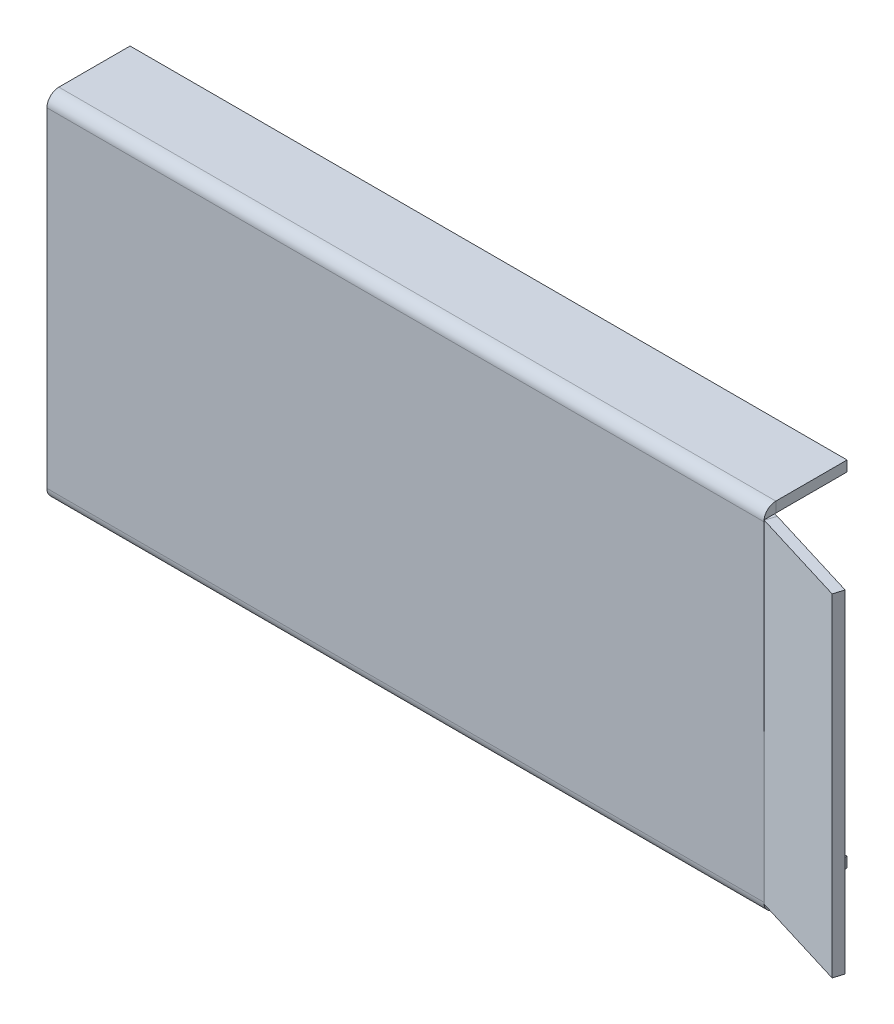
ISO-10303-21;
HEADER;
FILE_DESCRIPTION(('STEP AP214'),'2;1');
FILE_NAME('part.step','',(''),(''),'','','');
FILE_SCHEMA(('AUTOMOTIVE_DESIGN { 1 0 10303 214 1 1 1 1 }'));
ENDSEC;
DATA;
#1=APPLICATION_CONTEXT('core data for automotive mechanical design processes');
#2=APPLICATION_PROTOCOL_DEFINITION('international standard','automotive_design',2000,#1);
#3=PRODUCT_CONTEXT('',#1,'mechanical');
#4=PRODUCT('Part','Part','',(#3));
#5=PRODUCT_RELATED_PRODUCT_CATEGORY('part','',(#4));
#6=PRODUCT_DEFINITION_FORMATION('','',#4);
#7=PRODUCT_DEFINITION_CONTEXT('part definition',#1,'design');
#8=PRODUCT_DEFINITION('design','',#6,#7);
#9=PRODUCT_DEFINITION_SHAPE('','',#8);
#10=(LENGTH_UNIT() NAMED_UNIT(*) SI_UNIT(.MILLI.,.METRE.));
#11=(NAMED_UNIT(*) PLANE_ANGLE_UNIT() SI_UNIT($,.RADIAN.));
#12=(NAMED_UNIT(*) SI_UNIT($,.STERADIAN.) SOLID_ANGLE_UNIT());
#13=UNCERTAINTY_MEASURE_WITH_UNIT(LENGTH_MEASURE(1.E-05),#10,'distance_accuracy_value','');
#14=(GEOMETRIC_REPRESENTATION_CONTEXT(3) GLOBAL_UNCERTAINTY_ASSIGNED_CONTEXT((#13)) GLOBAL_UNIT_ASSIGNED_CONTEXT((#10,
#11,#12)) REPRESENTATION_CONTEXT('',''));
#15=CARTESIAN_POINT('',(0.,0.,0.));
#16=DIRECTION('',(0.,0.,1.));
#17=DIRECTION('',(1.,0.,0.));
#18=AXIS2_PLACEMENT_3D('',#15,#16,#17);
#19=CARTESIAN_POINT('',(344.889914392406,0.,-5.00000000000001));
#20=DIRECTION('',(-1.,0.,0.));
#21=DIRECTION('',(0.,0.,1.));
#22=AXIS2_PLACEMENT_3D('',#19,#20,#21);
#23=PLANE('',#22);
#24=DIRECTION('',(0.,0.,-1.));
#25=VECTOR('',#24,1.);
#26=CARTESIAN_POINT('',(344.889914392406,0.,0.));
#27=LINE('',#26,#25);
#28=CARTESIAN_POINT('',(344.889914392406,0.,0.));
#29=VERTEX_POINT('',#28);
#30=CARTESIAN_POINT('',(344.889914392406,0.,-0.0474875911966582));
#31=VERTEX_POINT('',#30);
#32=EDGE_CURVE('E345',#29,#31,#27,.T.);
#33=ORIENTED_EDGE('',*,*,#32,.T.);
#34=CARTESIAN_POINT('',(344.889914392406,-0.736599999999991,-5.73660000000001));
#35=DIRECTION('',(1.,0.,0.));
#36=DIRECTION('',(0.,1.,0.));
#37=AXIS2_PLACEMENT_3D('',#34,#35,#36);
#38=CIRCLE('',#37,5.73660000000002);
#39=CARTESIAN_POINT('',(344.889914392406,-0.736600000000004,0.));
#40=VERTEX_POINT('',#39);
#41=EDGE_CURVE('E11',#31,#40,#38,.T.);
#42=ORIENTED_EDGE('',*,*,#41,.T.);
#43=DIRECTION('',(0.,1.,0.));
#44=VECTOR('',#43,1.);
#45=CARTESIAN_POINT('',(344.889914392406,0.,0.));
#46=LINE('',#45,#44);
#47=EDGE_CURVE('E335',#29,#40,#46,.F.);
#48=ORIENTED_EDGE('',*,*,#47,.F.);
#49=EDGE_LOOP('',(#33,#42,#48));
#50=FACE_BOUND('',#49,.T.);
#51=ADVANCED_FACE('F40',(#50),#23,.T.);
#52=CARTESIAN_POINT('',(344.889914392406,-159.2634,-5.00000000000003));
#53=DIRECTION('',(-1.,0.,0.));
#54=DIRECTION('',(0.,0.,1.));
#55=AXIS2_PLACEMENT_3D('',#52,#53,#54);
#56=PLANE('',#55);
#57=CARTESIAN_POINT('',(344.889914392406,-159.2634,0.));
#58=VERTEX_POINT('',#57);
#59=CARTESIAN_POINT('',(344.889914392406,-160.,0.));
#60=VERTEX_POINT('',#59);
#61=EDGE_CURVE('E339',#58,#60,#46,.F.);
#62=ORIENTED_EDGE('',*,*,#61,.F.);
#63=CARTESIAN_POINT('',(344.889914392406,-159.2634,-5.73660000000001));
#64=DIRECTION('',(-1.,0.,0.));
#65=DIRECTION('',(0.,0.,1.));
#66=AXIS2_PLACEMENT_3D('',#63,#64,#65);
#67=CIRCLE('',#66,5.73659999999998);
#68=CARTESIAN_POINT('',(344.889914392406,-160.,-0.0474875911967076));
#69=VERTEX_POINT('',#68);
#70=EDGE_CURVE('E66',#58,#69,#67,.F.);
#71=ORIENTED_EDGE('',*,*,#70,.T.);
#72=DIRECTION('',(0.,0.,-1.));
#73=VECTOR('',#72,1.);
#74=CARTESIAN_POINT('',(344.889914392406,-160.,0.));
#75=LINE('',#74,#73);
#76=EDGE_CURVE('E342',#60,#69,#75,.T.);
#77=ORIENTED_EDGE('',*,*,#76,.F.);
#78=EDGE_LOOP('',(#62,#71,#77));
#79=FACE_BOUND('',#78,.T.);
#80=ADVANCED_FACE('F399',(#79),#56,.T.);
#81=CARTESIAN_POINT('',(0.,0.,-5.));
#82=DIRECTION('',(0.,0.,1.));
#83=DIRECTION('',(1.,0.,0.));
#84=AXIS2_PLACEMENT_3D('',#81,#82,#83);
#85=PLANE('',#84);
#86=DIRECTION('',(1.,0.,0.));
#87=VECTOR('',#86,1.);
#88=CARTESIAN_POINT('',(344.889914392406,-0.736600000000004,-4.99999999999999));
#89=LINE('',#88,#87);
#90=CARTESIAN_POINT('',(344.889914392406,-0.736600000000004,-4.99999999999999));
#91=VERTEX_POINT('',#90);
#92=CARTESIAN_POINT('',(0.,-0.736600000000029,-4.99999999999999));
#93=VERTEX_POINT('',#92);
#94=EDGE_CURVE('E233',#91,#93,#89,.F.);
#95=ORIENTED_EDGE('',*,*,#94,.F.);
#96=DIRECTION('',(0.,1.,0.));
#97=VECTOR('',#96,1.);
#98=CARTESIAN_POINT('',(344.889914392406,0.,-5.00000000000001));
#99=LINE('',#98,#97);
#100=CARTESIAN_POINT('',(344.889914392406,-159.2634,-5.00000000000003));
#101=VERTEX_POINT('',#100);
#102=EDGE_CURVE('E327',#91,#101,#99,.F.);
#103=ORIENTED_EDGE('',*,*,#102,.T.);
#104=DIRECTION('',(-1.,0.,0.));
#105=VECTOR('',#104,1.);
#106=CARTESIAN_POINT('',(0.,-159.2634,-5.00000000000003));
#107=LINE('',#106,#105);
#108=CARTESIAN_POINT('',(0.,-159.2634,-5.00000000000003));
#109=VERTEX_POINT('',#108);
#110=EDGE_CURVE('E283',#109,#101,#107,.F.);
#111=ORIENTED_EDGE('',*,*,#110,.F.);
#112=DIRECTION('',(0.,-1.,0.));
#113=VECTOR('',#112,1.);
#114=CARTESIAN_POINT('',(0.,0.,-5.));
#115=LINE('',#114,#113);
#116=EDGE_CURVE('E49',#93,#109,#115,.T.);
#117=ORIENTED_EDGE('',*,*,#116,.F.);
#118=EDGE_LOOP('',(#95,#103,#111,#117));
#119=FACE_BOUND('',#118,.T.);
#120=ADVANCED_FACE('F405',(#119),#85,.F.);
#121=CARTESIAN_POINT('',(0.,0.,0.));
#122=DIRECTION('',(0.,0.,1.));
#123=DIRECTION('',(1.,0.,0.));
#124=AXIS2_PLACEMENT_3D('',#121,#122,#123);
#125=PLANE('',#124);
#126=EDGE_CURVE('E338',#40,#58,#46,.F.);
#127=ORIENTED_EDGE('',*,*,#126,.F.);
#128=DIRECTION('',(1.,0.,0.));
#129=VECTOR('',#128,1.);
#130=CARTESIAN_POINT('',(344.889914392406,-0.736600000000091,0.));
#131=LINE('',#130,#129);
#132=CARTESIAN_POINT('',(0.,-0.736600000000029,0.));
#133=VERTEX_POINT('',#132);
#134=EDGE_CURVE('E184',#40,#133,#131,.F.);
#135=ORIENTED_EDGE('',*,*,#134,.T.);
#136=DIRECTION('',(0.,-1.,0.));
#137=VECTOR('',#136,1.);
#138=CARTESIAN_POINT('',(0.,0.,0.));
#139=LINE('',#138,#137);
#140=CARTESIAN_POINT('',(0.,-159.2634,0.));
#141=VERTEX_POINT('',#140);
#142=EDGE_CURVE('E44',#133,#141,#139,.T.);
#143=ORIENTED_EDGE('',*,*,#142,.T.);
#144=DIRECTION('',(-1.,0.,0.));
#145=VECTOR('',#144,1.);
#146=CARTESIAN_POINT('',(0.,-159.2634,0.));
#147=LINE('',#146,#145);
#148=EDGE_CURVE('E271',#141,#58,#147,.F.);
#149=ORIENTED_EDGE('',*,*,#148,.T.);
#150=EDGE_LOOP('',(#127,#135,#143,#149));
#151=FACE_BOUND('',#150,.T.);
#152=ADVANCED_FACE('F352',(#151),#125,.T.);
#153=CARTESIAN_POINT('',(0.,0.,-5.));
#154=DIRECTION('',(-1.,0.,0.));
#155=DIRECTION('',(0.,0.,1.));
#156=AXIS2_PLACEMENT_3D('',#153,#154,#155);
#157=PLANE('',#156);
#158=DIRECTION('',(0.,0.,1.));
#159=VECTOR('',#158,1.);
#160=CARTESIAN_POINT('',(0.,-0.736600000000029,-4.99999999999999));
#161=LINE('',#160,#159);
#162=EDGE_CURVE('E229',#93,#133,#161,.T.);
#163=ORIENTED_EDGE('',*,*,#162,.F.);
#164=ORIENTED_EDGE('',*,*,#116,.T.);
#165=DIRECTION('',(0.,0.,1.));
#166=VECTOR('',#165,1.);
#167=CARTESIAN_POINT('',(0.,-159.2634,-5.00000000000003));
#168=LINE('',#167,#166);
#169=EDGE_CURVE('E277',#109,#141,#168,.T.);
#170=ORIENTED_EDGE('',*,*,#169,.T.);
#171=ORIENTED_EDGE('',*,*,#142,.F.);
#172=EDGE_LOOP('',(#163,#164,#170,#171));
#173=FACE_BOUND('',#172,.T.);
#174=ADVANCED_FACE('F42',(#173),#157,.T.);
#175=CARTESIAN_POINT('',(344.889914392406,-160.,0.736599999999957));
#176=DIRECTION('',(0.,-1.,0.));
#177=DIRECTION('',(0.,0.,-1.));
#178=AXIS2_PLACEMENT_3D('',#175,#176,#177);
#179=PLANE('',#178);
#180=DIRECTION('',(0.292371704722731,0.,-0.956304755963037));
#181=VECTOR('',#180,1.);
#182=CARTESIAN_POINT('',(345.105275390105,-160.,0.0321859167576183));
#183=LINE('',#182,#181);
#184=CARTESIAN_POINT('',(345.105275390105,-160.,0.032185916757601));
#185=VERTEX_POINT('',#184);
#186=CARTESIAN_POINT('',(346.567133913719,-160.,-4.74933786305759));
#187=VERTEX_POINT('',#186);
#188=EDGE_CURVE('E293',#185,#187,#183,.T.);
#189=ORIENTED_EDGE('',*,*,#188,.F.);
#190=CARTESIAN_POINT('',(344.889914392406,-160.,0.736599999999957));
#191=DIRECTION('',(0.,1.,0.));
#192=DIRECTION('',(0.,0.,1.));
#193=AXIS2_PLACEMENT_3D('',#190,#191,#192);
#194=CIRCLE('',#193,0.736599999999982);
#195=EDGE_CURVE('E332',#60,#185,#194,.F.);
#196=ORIENTED_EDGE('',*,*,#195,.F.);
#197=ORIENTED_EDGE('',*,*,#76,.T.);
#198=CARTESIAN_POINT('',(344.889914392406,-160.,-5.));
#199=VERTEX_POINT('',#198);
#200=EDGE_CURVE('E344',#69,#199,#75,.T.);
#201=ORIENTED_EDGE('',*,*,#200,.T.);
#202=CARTESIAN_POINT('',(344.889914392406,-160.,0.736599999999957));
#203=DIRECTION('',(0.,1.,0.));
#204=DIRECTION('',(0.,0.,1.));
#205=AXIS2_PLACEMENT_3D('',#202,#203,#204);
#206=CIRCLE('',#205,5.73659999999998);
#207=EDGE_CURVE('E326',#199,#187,#206,.F.);
#208=ORIENTED_EDGE('',*,*,#207,.T.);
#209=EDGE_LOOP('',(#189,#196,#197,#201,#208));
#210=FACE_BOUND('',#209,.T.);
#211=ADVANCED_FACE('F439',(#210),#179,.T.);
#212=CARTESIAN_POINT('',(344.889914392406,0.,0.736599999999969));
#213=DIRECTION('',(0.,-1.,0.));
#214=DIRECTION('',(0.,0.,-1.));
#215=AXIS2_PLACEMENT_3D('',#212,#213,#214);
#216=PLANE('',#215);
#217=CARTESIAN_POINT('',(344.889914392406,0.,0.736599999999969));
#218=DIRECTION('',(0.,1.,0.));
#219=DIRECTION('',(0.,0.,1.));
#220=AXIS2_PLACEMENT_3D('',#217,#218,#219);
#221=CIRCLE('',#220,0.736599999999982);
#222=CARTESIAN_POINT('',(345.105275390105,0.,0.0321859167576128));
#223=VERTEX_POINT('',#222);
#224=EDGE_CURVE('E323',#223,#29,#221,.T.);
#225=ORIENTED_EDGE('',*,*,#224,.F.);
#226=DIRECTION('',(0.292371704722731,0.,-0.956304755963037));
#227=VECTOR('',#226,1.);
#228=CARTESIAN_POINT('',(345.105275390105,0.,0.0321859167576183));
#229=LINE('',#228,#227);
#230=CARTESIAN_POINT('',(346.567133913719,0.,-4.7493378630576));
#231=VERTEX_POINT('',#230);
#232=EDGE_CURVE('E296',#223,#231,#229,.T.);
#233=ORIENTED_EDGE('',*,*,#232,.T.);
#234=CARTESIAN_POINT('',(344.889914392406,0.,0.736599999999969));
#235=DIRECTION('',(0.,1.,0.));
#236=DIRECTION('',(0.,0.,1.));
#237=AXIS2_PLACEMENT_3D('',#234,#235,#236);
#238=CIRCLE('',#237,5.73659999999998);
#239=CARTESIAN_POINT('',(344.889914392406,0.,-5.00000000000001));
#240=VERTEX_POINT('',#239);
#241=EDGE_CURVE('E330',#231,#240,#238,.T.);
#242=ORIENTED_EDGE('',*,*,#241,.T.);
#243=EDGE_CURVE('E58',#31,#240,#27,.T.);
#244=ORIENTED_EDGE('',*,*,#243,.F.);
#245=ORIENTED_EDGE('',*,*,#32,.F.);
#246=EDGE_LOOP('',(#225,#233,#242,#244,#245));
#247=FACE_BOUND('',#246,.T.);
#248=ADVANCED_FACE('F434',(#247),#216,.F.);
#249=CARTESIAN_POINT('',(344.889914392406,0.,0.736599999999969));
#250=DIRECTION('',(0.,1.,0.));
#251=DIRECTION('',(0.292371704722731,0.,-0.956304755963037));
#252=AXIS2_PLACEMENT_3D('',#249,#250,#251);
#253=CYLINDRICAL_SURFACE('',#252,5.73659999999998);
#254=EDGE_CURVE('E324',#240,#91,#99,.F.);
#255=ORIENTED_EDGE('',*,*,#254,.F.);
#256=ORIENTED_EDGE('',*,*,#241,.F.);
#257=DIRECTION('',(0.,-1.,0.));
#258=VECTOR('',#257,1.);
#259=CARTESIAN_POINT('',(346.567133913719,0.,-4.74933786305759));
#260=LINE('',#259,#258);
#261=EDGE_CURVE('E299',#231,#187,#260,.T.);
#262=ORIENTED_EDGE('',*,*,#261,.T.);
#263=ORIENTED_EDGE('',*,*,#207,.F.);
#264=DIRECTION('',(0.,-1.,0.));
#265=VECTOR('',#264,1.);
#266=CARTESIAN_POINT('',(344.889914392406,-159.2634,-5.00000000000003));
#267=LINE('',#266,#265);
#268=EDGE_CURVE('E290',#101,#199,#267,.T.);
#269=ORIENTED_EDGE('',*,*,#268,.F.);
#270=ORIENTED_EDGE('',*,*,#102,.F.);
#271=EDGE_LOOP('',(#255,#256,#262,#263,#269,#270));
#272=FACE_BOUND('',#271,.T.);
#273=ADVANCED_FACE('F431',(#272),#253,.T.);
#274=CARTESIAN_POINT('',(344.889914392406,0.,0.736599999999969));
#275=DIRECTION('',(0.,1.,0.));
#276=DIRECTION('',(0.292371704722731,0.,-0.956304755963037));
#277=AXIS2_PLACEMENT_3D('',#274,#275,#276);
#278=CYLINDRICAL_SURFACE('',#277,0.736599999999982);
#279=ORIENTED_EDGE('',*,*,#47,.T.);
#280=ORIENTED_EDGE('',*,*,#126,.T.);
#281=ORIENTED_EDGE('',*,*,#61,.T.);
#282=ORIENTED_EDGE('',*,*,#195,.T.);
#283=DIRECTION('',(0.,1.,0.));
#284=VECTOR('',#283,1.);
#285=CARTESIAN_POINT('',(345.105275390105,-160.,0.0321859167576183));
#286=LINE('',#285,#284);
#287=EDGE_CURVE('E294',#185,#223,#286,.T.);
#288=ORIENTED_EDGE('',*,*,#287,.T.);
#289=ORIENTED_EDGE('',*,*,#224,.T.);
#290=EDGE_LOOP('',(#279,#280,#281,#282,#288,#289));
#291=FACE_BOUND('',#290,.T.);
#292=ADVANCED_FACE('F429',(#291),#278,.F.);
#293=CARTESIAN_POINT('',(346.461858523614,-160.,-4.7815237798152));
#294=DIRECTION('',(0.,1.,0.));
#295=DIRECTION('',(0.,0.,1.));
#296=AXIS2_PLACEMENT_3D('',#293,#294,#295);
#297=PLANE('',#296);
#298=ORIENTED_EDGE('',*,*,#188,.T.);
#299=DIRECTION('',(-0.956304755963037,0.,-0.292371704722731));
#300=VECTOR('',#299,1.);
#301=CARTESIAN_POINT('',(346.461858523614,-160.,-4.7815237798152));
#302=LINE('',#301,#300);
#303=CARTESIAN_POINT('',(393.562492804897,-160.,9.61858523613652));
#304=VERTEX_POINT('',#303);
#305=EDGE_CURVE('E304',#304,#187,#302,.T.);
#306=ORIENTED_EDGE('',*,*,#305,.F.);
#307=DIRECTION('',(-0.292371704722731,0.,0.956304755963037));
#308=VECTOR('',#307,1.);
#309=CARTESIAN_POINT('',(393.562492804897,-160.,9.61858523613652));
#310=LINE('',#309,#308);
#311=CARTESIAN_POINT('',(392.100634281284,-160.,14.4001090159517));
#312=VERTEX_POINT('',#311);
#313=EDGE_CURVE('E312',#304,#312,#310,.T.);
#314=ORIENTED_EDGE('',*,*,#313,.T.);
#315=DIRECTION('',(-0.956304755963037,0.,-0.292371704722731));
#316=VECTOR('',#315,1.);
#317=CARTESIAN_POINT('',(345.,-160.,0.));
#318=LINE('',#317,#316);
#319=EDGE_CURVE('E303',#312,#185,#318,.T.);
#320=ORIENTED_EDGE('',*,*,#319,.T.);
#321=EDGE_LOOP('',(#298,#306,#314,#320));
#322=FACE_BOUND('',#321,.T.);
#323=ADVANCED_FACE('F425',(#322),#297,.F.);
#324=CARTESIAN_POINT('',(393.562492804897,0.,9.61858523613652));
#325=DIRECTION('',(0.,-1.,0.));
#326=DIRECTION('',(0.,0.,-1.));
#327=AXIS2_PLACEMENT_3D('',#324,#325,#326);
#328=PLANE('',#327);
#329=ORIENTED_EDGE('',*,*,#232,.F.);
#330=DIRECTION('',(0.956304755963037,0.,0.292371704722731));
#331=VECTOR('',#330,1.);
#332=CARTESIAN_POINT('',(392.100634281284,0.,14.4001090159517));
#333=LINE('',#332,#331);
#334=CARTESIAN_POINT('',(392.100634281284,0.,14.4001090159517));
#335=VERTEX_POINT('',#334);
#336=EDGE_CURVE('E315',#223,#335,#333,.T.);
#337=ORIENTED_EDGE('',*,*,#336,.T.);
#338=DIRECTION('',(-0.292371704722731,0.,0.956304755963037));
#339=VECTOR('',#338,1.);
#340=CARTESIAN_POINT('',(393.562492804897,0.,9.61858523613652));
#341=LINE('',#340,#339);
#342=CARTESIAN_POINT('',(393.562492804897,0.,9.61858523613652));
#343=VERTEX_POINT('',#342);
#344=EDGE_CURVE('E320',#343,#335,#341,.T.);
#345=ORIENTED_EDGE('',*,*,#344,.F.);
#346=DIRECTION('',(0.956304755963037,0.,0.292371704722731));
#347=VECTOR('',#346,1.);
#348=CARTESIAN_POINT('',(393.562492804897,0.,9.61858523613652));
#349=LINE('',#348,#347);
#350=EDGE_CURVE('E307',#231,#343,#349,.T.);
#351=ORIENTED_EDGE('',*,*,#350,.F.);
#352=EDGE_LOOP('',(#329,#337,#345,#351));
#353=FACE_BOUND('',#352,.T.);
#354=ADVANCED_FACE('F414',(#353),#328,.F.);
#355=CARTESIAN_POINT('',(30.9528772578677,0.,-101.242299628517));
#356=DIRECTION('',(-0.292371704722731,0.,0.956304755963037));
#357=DIRECTION('',(0.956304755963037,0.,0.292371704722731));
#358=AXIS2_PLACEMENT_3D('',#355,#356,#357);
#359=PLANE('',#358);
#360=ORIENTED_EDGE('',*,*,#261,.F.);
#361=ORIENTED_EDGE('',*,*,#350,.T.);
#362=DIRECTION('',(0.,-1.,0.));
#363=VECTOR('',#362,1.);
#364=CARTESIAN_POINT('',(393.562492804897,-160.,9.61858523613652));
#365=LINE('',#364,#363);
#366=EDGE_CURVE('E310',#343,#304,#365,.T.);
#367=ORIENTED_EDGE('',*,*,#366,.T.);
#368=ORIENTED_EDGE('',*,*,#305,.T.);
#369=EDGE_LOOP('',(#360,#361,#367,#368));
#370=FACE_BOUND('',#369,.T.);
#371=ADVANCED_FACE('F410',(#370),#359,.F.);
#372=CARTESIAN_POINT('',(29.4910187342541,0.,-96.460775848702));
#373=DIRECTION('',(-0.292371704722731,0.,0.956304755963037));
#374=DIRECTION('',(0.956304755963037,0.,0.292371704722731));
#375=AXIS2_PLACEMENT_3D('',#372,#373,#374);
#376=PLANE('',#375);
#377=ORIENTED_EDGE('',*,*,#336,.F.);
#378=ORIENTED_EDGE('',*,*,#287,.F.);
#379=ORIENTED_EDGE('',*,*,#319,.F.);
#380=DIRECTION('',(0.,-1.,0.));
#381=VECTOR('',#380,1.);
#382=CARTESIAN_POINT('',(392.100634281284,-160.,14.4001090159517));
#383=LINE('',#382,#381);
#384=EDGE_CURVE('E308',#335,#312,#383,.T.);
#385=ORIENTED_EDGE('',*,*,#384,.F.);
#386=EDGE_LOOP('',(#377,#378,#379,#385));
#387=FACE_BOUND('',#386,.T.);
#388=ADVANCED_FACE('F413',(#387),#376,.T.);
#389=CARTESIAN_POINT('',(393.562492804897,-160.,9.61858523613652));
#390=DIRECTION('',(-0.956304755963037,0.,-0.292371704722731));
#391=DIRECTION('',(-0.292371704722731,0.,0.956304755963037));
#392=AXIS2_PLACEMENT_3D('',#389,#390,#391);
#393=PLANE('',#392);
#394=ORIENTED_EDGE('',*,*,#384,.T.);
#395=ORIENTED_EDGE('',*,*,#313,.F.);
#396=ORIENTED_EDGE('',*,*,#366,.F.);
#397=ORIENTED_EDGE('',*,*,#344,.T.);
#398=EDGE_LOOP('',(#394,#395,#396,#397));
#399=FACE_BOUND('',#398,.T.);
#400=ADVANCED_FACE('F418',(#399),#393,.F.);
#401=CARTESIAN_POINT('',(344.889914392406,-159.2634,-5.73660000000001));
#402=DIRECTION('',(1.,0.,0.));
#403=DIRECTION('',(0.,0.,-1.));
#404=AXIS2_PLACEMENT_3D('',#401,#402,#403);
#405=PLANE('',#404);
#406=ORIENTED_EDGE('',*,*,#200,.F.);
#407=CARTESIAN_POINT('',(344.889914392406,-165.,-5.73659999999999));
#408=VERTEX_POINT('',#407);
#409=EDGE_CURVE('E274',#69,#408,#67,.F.);
#410=ORIENTED_EDGE('',*,*,#409,.T.);
#411=DIRECTION('',(0.,-1.,0.));
#412=VECTOR('',#411,1.);
#413=CARTESIAN_POINT('',(344.889914392406,-160.,-5.73660000000001));
#414=LINE('',#413,#412);
#415=CARTESIAN_POINT('',(344.889914392406,-160.,-5.73660000000001));
#416=VERTEX_POINT('',#415);
#417=EDGE_CURVE('E239',#416,#408,#414,.T.);
#418=ORIENTED_EDGE('',*,*,#417,.F.);
#419=CARTESIAN_POINT('',(344.889914392406,-159.2634,-5.73660000000001));
#420=DIRECTION('',(-1.,0.,0.));
#421=DIRECTION('',(0.,0.,1.));
#422=AXIS2_PLACEMENT_3D('',#419,#420,#421);
#423=CIRCLE('',#422,0.736599999999976);
#424=EDGE_CURVE('E280',#101,#416,#423,.F.);
#425=ORIENTED_EDGE('',*,*,#424,.F.);
#426=ORIENTED_EDGE('',*,*,#268,.T.);
#427=EDGE_LOOP('',(#406,#410,#418,#425,#426));
#428=FACE_BOUND('',#427,.T.);
#429=ADVANCED_FACE('F382',(#428),#405,.T.);
#430=CARTESIAN_POINT('',(0.,-159.2634,-5.73660000000001));
#431=DIRECTION('',(1.,0.,0.));
#432=DIRECTION('',(0.,0.,-1.));
#433=AXIS2_PLACEMENT_3D('',#430,#431,#432);
#434=PLANE('',#433);
#435=CARTESIAN_POINT('',(0.,-159.2634,-5.73660000000001));
#436=DIRECTION('',(-1.,0.,0.));
#437=DIRECTION('',(0.,0.,1.));
#438=AXIS2_PLACEMENT_3D('',#435,#436,#437);
#439=CIRCLE('',#438,0.736599999999976);
#440=CARTESIAN_POINT('',(0.,-160.,-5.73660000000001));
#441=VERTEX_POINT('',#440);
#442=EDGE_CURVE('E270',#441,#109,#439,.T.);
#443=ORIENTED_EDGE('',*,*,#442,.F.);
#444=DIRECTION('',(0.,-1.,0.));
#445=VECTOR('',#444,1.);
#446=CARTESIAN_POINT('',(0.,-160.,-5.73660000000001));
#447=LINE('',#446,#445);
#448=CARTESIAN_POINT('',(0.,-165.,-5.73659999999999));
#449=VERTEX_POINT('',#448);
#450=EDGE_CURVE('E242',#441,#449,#447,.T.);
#451=ORIENTED_EDGE('',*,*,#450,.T.);
#452=CARTESIAN_POINT('',(0.,-159.2634,-5.73660000000001));
#453=DIRECTION('',(-1.,0.,0.));
#454=DIRECTION('',(0.,0.,1.));
#455=AXIS2_PLACEMENT_3D('',#452,#453,#454);
#456=CIRCLE('',#455,5.73659999999998);
#457=EDGE_CURVE('E275',#449,#141,#456,.T.);
#458=ORIENTED_EDGE('',*,*,#457,.T.);
#459=ORIENTED_EDGE('',*,*,#169,.F.);
#460=EDGE_LOOP('',(#443,#451,#458,#459));
#461=FACE_BOUND('',#460,.T.);
#462=ADVANCED_FACE('F360',(#461),#434,.F.);
#463=CARTESIAN_POINT('',(0.,-159.2634,-5.73660000000001));
#464=DIRECTION('',(-1.,0.,0.));
#465=DIRECTION('',(0.,-1.,0.));
#466=AXIS2_PLACEMENT_3D('',#463,#464,#465);
#467=CYLINDRICAL_SURFACE('',#466,5.73659999999998);
#468=ORIENTED_EDGE('',*,*,#148,.F.);
#469=ORIENTED_EDGE('',*,*,#457,.F.);
#470=DIRECTION('',(1.,0.,0.));
#471=VECTOR('',#470,1.);
#472=CARTESIAN_POINT('',(0.,-165.,-5.73659999999999));
#473=LINE('',#472,#471);
#474=EDGE_CURVE('E245',#449,#408,#473,.T.);
#475=ORIENTED_EDGE('',*,*,#474,.T.);
#476=ORIENTED_EDGE('',*,*,#409,.F.);
#477=ORIENTED_EDGE('',*,*,#70,.F.);
#478=EDGE_LOOP('',(#468,#469,#475,#476,#477));
#479=FACE_BOUND('',#478,.T.);
#480=ADVANCED_FACE('F358',(#479),#467,.T.);
#481=CARTESIAN_POINT('',(0.,-159.2634,-5.73660000000001));
#482=DIRECTION('',(-1.,0.,0.));
#483=DIRECTION('',(0.,-1.,0.));
#484=AXIS2_PLACEMENT_3D('',#481,#482,#483);
#485=CYLINDRICAL_SURFACE('',#484,0.736599999999976);
#486=ORIENTED_EDGE('',*,*,#110,.T.);
#487=ORIENTED_EDGE('',*,*,#424,.T.);
#488=DIRECTION('',(-1.,0.,0.));
#489=VECTOR('',#488,1.);
#490=CARTESIAN_POINT('',(344.889914392406,-160.,-5.73660000000001));
#491=LINE('',#490,#489);
#492=EDGE_CURVE('E240',#416,#441,#491,.T.);
#493=ORIENTED_EDGE('',*,*,#492,.T.);
#494=ORIENTED_EDGE('',*,*,#442,.T.);
#495=EDGE_LOOP('',(#486,#487,#493,#494));
#496=FACE_BOUND('',#495,.T.);
#497=ADVANCED_FACE('F385',(#496),#485,.F.);
#498=CARTESIAN_POINT('',(0.,-165.,-40.));
#499=DIRECTION('',(1.,0.,0.));
#500=DIRECTION('',(0.,0.,-1.));
#501=AXIS2_PLACEMENT_3D('',#498,#499,#500);
#502=PLANE('',#501);
#503=ORIENTED_EDGE('',*,*,#450,.F.);
#504=DIRECTION('',(0.,0.,-1.));
#505=VECTOR('',#504,1.);
#506=CARTESIAN_POINT('',(0.,-160.,-40.));
#507=LINE('',#506,#505);
#508=CARTESIAN_POINT('',(0.,-160.,-40.));
#509=VERTEX_POINT('',#508);
#510=EDGE_CURVE('E250',#441,#509,#507,.T.);
#511=ORIENTED_EDGE('',*,*,#510,.T.);
#512=DIRECTION('',(0.,1.,0.));
#513=VECTOR('',#512,1.);
#514=CARTESIAN_POINT('',(0.,-165.,-40.));
#515=LINE('',#514,#513);
#516=CARTESIAN_POINT('',(0.,-165.,-40.));
#517=VERTEX_POINT('',#516);
#518=EDGE_CURVE('E267',#517,#509,#515,.T.);
#519=ORIENTED_EDGE('',*,*,#518,.F.);
#520=DIRECTION('',(0.,0.,-1.));
#521=VECTOR('',#520,1.);
#522=CARTESIAN_POINT('',(0.,-165.,-40.));
#523=LINE('',#522,#521);
#524=EDGE_CURVE('E251',#449,#517,#523,.T.);
#525=ORIENTED_EDGE('',*,*,#524,.F.);
#526=EDGE_LOOP('',(#503,#511,#519,#525));
#527=FACE_BOUND('',#526,.T.);
#528=ADVANCED_FACE('F371',(#527),#502,.F.);
#529=CARTESIAN_POINT('',(344.889914392406,-165.,-4.99999999999998));
#530=DIRECTION('',(-1.,0.,0.));
#531=DIRECTION('',(0.,-1.,0.));
#532=AXIS2_PLACEMENT_3D('',#529,#530,#531);
#533=PLANE('',#532);
#534=ORIENTED_EDGE('',*,*,#417,.T.);
#535=DIRECTION('',(0.,0.,1.));
#536=VECTOR('',#535,1.);
#537=CARTESIAN_POINT('',(344.889914392406,-165.,-4.99999999999998));
#538=LINE('',#537,#536);
#539=CARTESIAN_POINT('',(344.889914392406,-165.,-40.));
#540=VERTEX_POINT('',#539);
#541=EDGE_CURVE('E256',#540,#408,#538,.T.);
#542=ORIENTED_EDGE('',*,*,#541,.F.);
#543=DIRECTION('',(0.,1.,0.));
#544=VECTOR('',#543,1.);
#545=CARTESIAN_POINT('',(344.889914392406,-165.,-40.));
#546=LINE('',#545,#544);
#547=CARTESIAN_POINT('',(344.889914392406,-160.,-40.));
#548=VERTEX_POINT('',#547);
#549=EDGE_CURVE('E259',#540,#548,#546,.T.);
#550=ORIENTED_EDGE('',*,*,#549,.T.);
#551=DIRECTION('',(0.,0.,1.));
#552=VECTOR('',#551,1.);
#553=CARTESIAN_POINT('',(344.889914392406,-160.,-5.));
#554=LINE('',#553,#552);
#555=EDGE_CURVE('E254',#548,#416,#554,.T.);
#556=ORIENTED_EDGE('',*,*,#555,.T.);
#557=EDGE_LOOP('',(#534,#542,#550,#556));
#558=FACE_BOUND('',#557,.T.);
#559=ADVANCED_FACE('F378',(#558),#533,.F.);
#560=CARTESIAN_POINT('',(0.,-165.,5.24987932237144E-13));
#561=DIRECTION('',(0.,1.,0.));
#562=DIRECTION('',(0.,0.,1.));
#563=AXIS2_PLACEMENT_3D('',#560,#561,#562);
#564=PLANE('',#563);
#565=ORIENTED_EDGE('',*,*,#474,.F.);
#566=ORIENTED_EDGE('',*,*,#524,.T.);
#567=DIRECTION('',(1.,0.,0.));
#568=VECTOR('',#567,1.);
#569=CARTESIAN_POINT('',(344.889914392406,-165.,-40.));
#570=LINE('',#569,#568);
#571=EDGE_CURVE('E253',#517,#540,#570,.T.);
#572=ORIENTED_EDGE('',*,*,#571,.T.);
#573=ORIENTED_EDGE('',*,*,#541,.T.);
#574=EDGE_LOOP('',(#565,#566,#572,#573));
#575=FACE_BOUND('',#574,.T.);
#576=ADVANCED_FACE('F367',(#575),#564,.F.);
#577=CARTESIAN_POINT('',(0.,-160.,5.07530525542928E-13));
#578=DIRECTION('',(0.,1.,0.));
#579=DIRECTION('',(0.,0.,1.));
#580=AXIS2_PLACEMENT_3D('',#577,#578,#579);
#581=PLANE('',#580);
#582=ORIENTED_EDGE('',*,*,#510,.F.);
#583=ORIENTED_EDGE('',*,*,#492,.F.);
#584=ORIENTED_EDGE('',*,*,#555,.F.);
#585=DIRECTION('',(1.,0.,0.));
#586=VECTOR('',#585,1.);
#587=CARTESIAN_POINT('',(344.889914392406,-160.,-40.));
#588=LINE('',#587,#586);
#589=EDGE_CURVE('E261',#509,#548,#588,.T.);
#590=ORIENTED_EDGE('',*,*,#589,.F.);
#591=EDGE_LOOP('',(#582,#583,#584,#590));
#592=FACE_BOUND('',#591,.T.);
#593=ADVANCED_FACE('F387',(#592),#581,.T.);
#594=CARTESIAN_POINT('',(344.889914392406,-165.,-40.));
#595=DIRECTION('',(0.,0.,1.));
#596=DIRECTION('',(0.,-1.,0.));
#597=AXIS2_PLACEMENT_3D('',#594,#595,#596);
#598=PLANE('',#597);
#599=ORIENTED_EDGE('',*,*,#589,.T.);
#600=ORIENTED_EDGE('',*,*,#549,.F.);
#601=ORIENTED_EDGE('',*,*,#571,.F.);
#602=ORIENTED_EDGE('',*,*,#518,.T.);
#603=EDGE_LOOP('',(#599,#600,#601,#602));
#604=FACE_BOUND('',#603,.T.);
#605=ADVANCED_FACE('F374',(#604),#598,.F.);
#606=CARTESIAN_POINT('',(0.,-0.736600000000016,-5.73660000000001));
#607=DIRECTION('',(-1.,0.,0.));
#608=DIRECTION('',(0.,-1.,0.));
#609=AXIS2_PLACEMENT_3D('',#606,#607,#608);
#610=PLANE('',#609);
#611=DIRECTION('',(0.,1.,0.));
#612=VECTOR('',#611,1.);
#613=CARTESIAN_POINT('',(0.,0.,-5.7366));
#614=LINE('',#613,#612);
#615=CARTESIAN_POINT('',(0.,0.,-5.7366));
#616=VERTEX_POINT('',#615);
#617=CARTESIAN_POINT('',(0.,5.,-5.73659999999999));
#618=VERTEX_POINT('',#617);
#619=EDGE_CURVE('E742',#616,#618,#614,.T.);
#620=ORIENTED_EDGE('',*,*,#619,.F.);
#621=CARTESIAN_POINT('',(0.,-0.736600000000016,-5.73660000000001));
#622=DIRECTION('',(1.,0.,0.));
#623=DIRECTION('',(0.,1.,0.));
#624=AXIS2_PLACEMENT_3D('',#621,#622,#623);
#625=CIRCLE('',#624,0.736600000000019);
#626=EDGE_CURVE('E185',#93,#616,#625,.F.);
#627=ORIENTED_EDGE('',*,*,#626,.F.);
#628=ORIENTED_EDGE('',*,*,#162,.T.);
#629=CARTESIAN_POINT('',(0.,-0.736600000000016,-5.73660000000001));
#630=DIRECTION('',(1.,0.,0.));
#631=DIRECTION('',(0.,1.,0.));
#632=AXIS2_PLACEMENT_3D('',#629,#630,#631);
#633=CIRCLE('',#632,5.73660000000002);
#634=EDGE_CURVE('E228',#133,#618,#633,.F.);
#635=ORIENTED_EDGE('',*,*,#634,.T.);
#636=EDGE_LOOP('',(#620,#627,#628,#635));
#637=FACE_BOUND('',#636,.T.);
#638=ADVANCED_FACE('F394',(#637),#610,.T.);
#639=CARTESIAN_POINT('',(344.889914392406,-0.736599999999991,-5.73660000000001));
#640=DIRECTION('',(-1.,0.,0.));
#641=DIRECTION('',(0.,-1.,0.));
#642=AXIS2_PLACEMENT_3D('',#639,#640,#641);
#643=PLANE('',#642);
#644=CARTESIAN_POINT('',(344.889914392406,5.,-5.73659999999999));
#645=VERTEX_POINT('',#644);
#646=EDGE_CURVE('E51',#645,#31,#38,.T.);
#647=ORIENTED_EDGE('',*,*,#646,.T.);
#648=ORIENTED_EDGE('',*,*,#243,.T.);
#649=ORIENTED_EDGE('',*,*,#254,.T.);
#650=CARTESIAN_POINT('',(344.889914392406,-0.736599999999991,-5.73660000000001));
#651=DIRECTION('',(1.,0.,0.));
#652=DIRECTION('',(0.,1.,0.));
#653=AXIS2_PLACEMENT_3D('',#650,#651,#652);
#654=CIRCLE('',#653,0.736600000000019);
#655=CARTESIAN_POINT('',(344.889914392406,0.,-5.7366));
#656=VERTEX_POINT('',#655);
#657=EDGE_CURVE('E192',#656,#91,#654,.T.);
#658=ORIENTED_EDGE('',*,*,#657,.F.);
#659=DIRECTION('',(0.,1.,0.));
#660=VECTOR('',#659,1.);
#661=CARTESIAN_POINT('',(344.889914392406,0.,-5.73660000000001));
#662=LINE('',#661,#660);
#663=EDGE_CURVE('E188',#656,#645,#662,.T.);
#664=ORIENTED_EDGE('',*,*,#663,.T.);
#665=EDGE_LOOP('',(#647,#648,#649,#658,#664));
#666=FACE_BOUND('',#665,.T.);
#667=ADVANCED_FACE('F189',(#666),#643,.F.);
#668=CARTESIAN_POINT('',(344.889914392406,-0.736599999999991,-5.73660000000001));
#669=DIRECTION('',(1.,0.,0.));
#670=DIRECTION('',(0.,1.,0.));
#671=AXIS2_PLACEMENT_3D('',#668,#669,#670);
#672=CYLINDRICAL_SURFACE('',#671,5.73660000000002);
#673=ORIENTED_EDGE('',*,*,#134,.F.);
#674=ORIENTED_EDGE('',*,*,#41,.F.);
#675=ORIENTED_EDGE('',*,*,#646,.F.);
#676=DIRECTION('',(-1.,0.,0.));
#677=VECTOR('',#676,1.);
#678=CARTESIAN_POINT('',(0.,5.,-5.73659999999998));
#679=LINE('',#678,#677);
#680=EDGE_CURVE('E181',#645,#618,#679,.T.);
#681=ORIENTED_EDGE('',*,*,#680,.T.);
#682=ORIENTED_EDGE('',*,*,#634,.F.);
#683=EDGE_LOOP('',(#673,#674,#675,#681,#682));
#684=FACE_BOUND('',#683,.T.);
#685=ADVANCED_FACE('F178',(#684),#672,.T.);
#686=CARTESIAN_POINT('',(344.889914392406,-0.736599999999991,-5.73660000000001));
#687=DIRECTION('',(1.,0.,0.));
#688=DIRECTION('',(0.,1.,0.));
#689=AXIS2_PLACEMENT_3D('',#686,#687,#688);
#690=CYLINDRICAL_SURFACE('',#689,0.736600000000019);
#691=ORIENTED_EDGE('',*,*,#94,.T.);
#692=ORIENTED_EDGE('',*,*,#626,.T.);
#693=DIRECTION('',(1.,0.,0.));
#694=VECTOR('',#693,1.);
#695=CARTESIAN_POINT('',(0.,0.,-5.7366));
#696=LINE('',#695,#694);
#697=EDGE_CURVE('E196',#616,#656,#696,.T.);
#698=ORIENTED_EDGE('',*,*,#697,.T.);
#699=ORIENTED_EDGE('',*,*,#657,.T.);
#700=EDGE_LOOP('',(#691,#692,#698,#699));
#701=FACE_BOUND('',#700,.T.);
#702=ADVANCED_FACE('F567',(#701),#690,.F.);
#703=CARTESIAN_POINT('',(344.889914392406,5.00000000000012,-40.));
#704=DIRECTION('',(-1.,0.,0.));
#705=DIRECTION('',(0.,-1.,0.));
#706=AXIS2_PLACEMENT_3D('',#703,#704,#705);
#707=PLANE('',#706);
#708=ORIENTED_EDGE('',*,*,#663,.F.);
#709=DIRECTION('',(0.,0.,-1.));
#710=VECTOR('',#709,1.);
#711=CARTESIAN_POINT('',(344.889914392406,1.22571821468642E-13,-40.));
#712=LINE('',#711,#710);
#713=CARTESIAN_POINT('',(344.889914392406,1.22571821468642E-13,-40.));
#714=VERTEX_POINT('',#713);
#715=EDGE_CURVE('E205',#656,#714,#712,.T.);
#716=ORIENTED_EDGE('',*,*,#715,.T.);
#717=DIRECTION('',(0.,-1.,0.));
#718=VECTOR('',#717,1.);
#719=CARTESIAN_POINT('',(344.889914392406,5.00000000000012,-40.));
#720=LINE('',#719,#718);
#721=CARTESIAN_POINT('',(344.889914392406,5.00000000000012,-40.));
#722=VERTEX_POINT('',#721);
#723=EDGE_CURVE('E210',#722,#714,#720,.T.);
#724=ORIENTED_EDGE('',*,*,#723,.F.);
#725=DIRECTION('',(0.,0.,-1.));
#726=VECTOR('',#725,1.);
#727=CARTESIAN_POINT('',(344.889914392406,5.00000000000012,-40.));
#728=LINE('',#727,#726);
#729=EDGE_CURVE('E201',#645,#722,#728,.T.);
#730=ORIENTED_EDGE('',*,*,#729,.F.);
#731=EDGE_LOOP('',(#708,#716,#724,#730));
#732=FACE_BOUND('',#731,.T.);
#733=ADVANCED_FACE('F208',(#732),#707,.F.);
#734=CARTESIAN_POINT('',(0.,5.,-4.99999999999998));
#735=DIRECTION('',(1.,0.,0.));
#736=DIRECTION('',(0.,0.,-1.));
#737=AXIS2_PLACEMENT_3D('',#734,#735,#736);
#738=PLANE('',#737);
#739=ORIENTED_EDGE('',*,*,#619,.T.);
#740=DIRECTION('',(0.,0.,1.));
#741=VECTOR('',#740,1.);
#742=CARTESIAN_POINT('',(0.,5.,-4.99999999999998));
#743=LINE('',#742,#741);
#744=CARTESIAN_POINT('',(0.,5.00000000000012,-40.));
#745=VERTEX_POINT('',#744);
#746=EDGE_CURVE('E204',#745,#618,#743,.T.);
#747=ORIENTED_EDGE('',*,*,#746,.F.);
#748=DIRECTION('',(0.,-1.,0.));
#749=VECTOR('',#748,1.);
#750=CARTESIAN_POINT('',(0.,5.00000000000012,-40.));
#751=LINE('',#750,#749);
#752=CARTESIAN_POINT('',(0.,1.2220184685951E-13,-40.));
#753=VERTEX_POINT('',#752);
#754=EDGE_CURVE('E221',#745,#753,#751,.T.);
#755=ORIENTED_EDGE('',*,*,#754,.T.);
#756=DIRECTION('',(0.,0.,1.));
#757=VECTOR('',#756,1.);
#758=CARTESIAN_POINT('',(0.,0.,-5.));
#759=LINE('',#758,#757);
#760=EDGE_CURVE('E212',#753,#616,#759,.T.);
#761=ORIENTED_EDGE('',*,*,#760,.T.);
#762=EDGE_LOOP('',(#739,#747,#755,#761));
#763=FACE_BOUND('',#762,.T.);
#764=ADVANCED_FACE('F587',(#763),#738,.F.);
#765=CARTESIAN_POINT('',(0.,4.99999999999998,0.));
#766=DIRECTION('',(0.,-1.,0.));
#767=DIRECTION('',(0.,0.,-1.));
#768=AXIS2_PLACEMENT_3D('',#765,#766,#767);
#769=PLANE('',#768);
#770=ORIENTED_EDGE('',*,*,#680,.F.);
#771=ORIENTED_EDGE('',*,*,#729,.T.);
#772=DIRECTION('',(-1.,0.,0.));
#773=VECTOR('',#772,1.);
#774=CARTESIAN_POINT('',(0.,5.00000000000012,-40.));
#775=LINE('',#774,#773);
#776=EDGE_CURVE('E211',#722,#745,#775,.T.);
#777=ORIENTED_EDGE('',*,*,#776,.T.);
#778=ORIENTED_EDGE('',*,*,#746,.T.);
#779=EDGE_LOOP('',(#770,#771,#777,#778));
#780=FACE_BOUND('',#779,.T.);
#781=ADVANCED_FACE('F200',(#780),#769,.F.);
#782=CARTESIAN_POINT('',(0.,0.,0.));
#783=DIRECTION('',(0.,-1.,0.));
#784=DIRECTION('',(0.,0.,-1.));
#785=AXIS2_PLACEMENT_3D('',#782,#783,#784);
#786=PLANE('',#785);
#787=ORIENTED_EDGE('',*,*,#715,.F.);
#788=ORIENTED_EDGE('',*,*,#697,.F.);
#789=ORIENTED_EDGE('',*,*,#760,.F.);
#790=DIRECTION('',(-1.,0.,0.));
#791=VECTOR('',#790,1.);
#792=CARTESIAN_POINT('',(0.,1.2220184685951E-13,-40.));
#793=LINE('',#792,#791);
#794=EDGE_CURVE('E216',#714,#753,#793,.T.);
#795=ORIENTED_EDGE('',*,*,#794,.F.);
#796=EDGE_LOOP('',(#787,#788,#789,#795));
#797=FACE_BOUND('',#796,.T.);
#798=ADVANCED_FACE('F607',(#797),#786,.T.);
#799=CARTESIAN_POINT('',(0.,5.00000000000012,-40.));
#800=DIRECTION('',(0.,0.,1.));
#801=DIRECTION('',(0.,-1.,0.));
#802=AXIS2_PLACEMENT_3D('',#799,#800,#801);
#803=PLANE('',#802);
#804=ORIENTED_EDGE('',*,*,#794,.T.);
#805=ORIENTED_EDGE('',*,*,#754,.F.);
#806=ORIENTED_EDGE('',*,*,#776,.F.);
#807=ORIENTED_EDGE('',*,*,#723,.T.);
#808=EDGE_LOOP('',(#804,#805,#806,#807));
#809=FACE_BOUND('',#808,.T.);
#810=ADVANCED_FACE('F617',(#809),#803,.F.);
#811=CLOSED_SHELL('',(#51,#80,#120,#152,#174,#211,#248,#273,#292,#323,#354,#371,#388,#400,#429,
#462,#480,#497,#528,#559,#576,#593,#605,#638,#667,#685,#702,#733,#764,#781,#798,#810));
#812=MANIFOLD_SOLID_BREP('B2',#811);
#813=ADVANCED_BREP_SHAPE_REPRESENTATION('',(#18,#812),#14);
#814=SHAPE_DEFINITION_REPRESENTATION(#9,#813);
ENDSEC;
END-ISO-10303-21;
